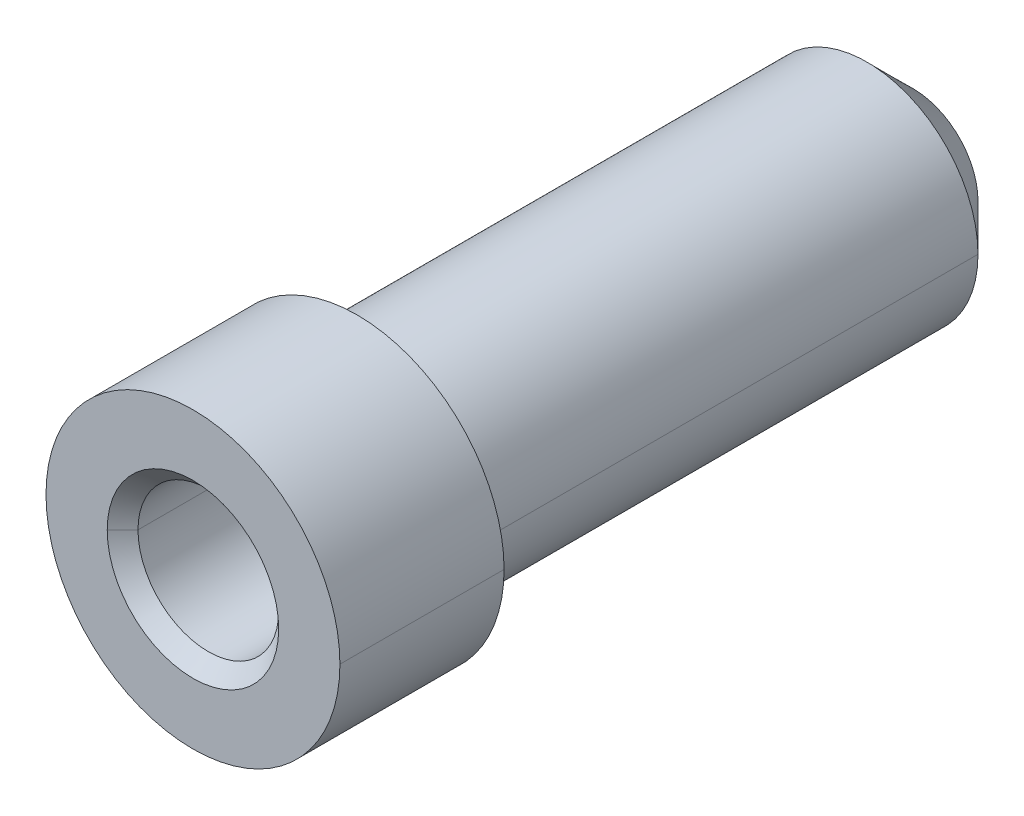
ISO-10303-21;
HEADER;
FILE_DESCRIPTION(('STEP AP214'),'2;1');
FILE_NAME('part.step','',(''),(''),'','','');
FILE_SCHEMA(('AUTOMOTIVE_DESIGN { 1 0 10303 214 1 1 1 1 }'));
ENDSEC;
DATA;
#1=APPLICATION_CONTEXT('core data for automotive mechanical design processes');
#2=APPLICATION_PROTOCOL_DEFINITION('international standard','automotive_design',2000,#1);
#3=PRODUCT_CONTEXT('',#1,'mechanical');
#4=PRODUCT('Part','Part','',(#3));
#5=PRODUCT_RELATED_PRODUCT_CATEGORY('part','',(#4));
#6=PRODUCT_DEFINITION_FORMATION('','',#4);
#7=PRODUCT_DEFINITION_CONTEXT('part definition',#1,'design');
#8=PRODUCT_DEFINITION('design','',#6,#7);
#9=PRODUCT_DEFINITION_SHAPE('','',#8);
#10=(LENGTH_UNIT() NAMED_UNIT(*) SI_UNIT(.MILLI.,.METRE.));
#11=(NAMED_UNIT(*) PLANE_ANGLE_UNIT() SI_UNIT($,.RADIAN.));
#12=(NAMED_UNIT(*) SI_UNIT($,.STERADIAN.) SOLID_ANGLE_UNIT());
#13=UNCERTAINTY_MEASURE_WITH_UNIT(LENGTH_MEASURE(1.E-05),#10,'distance_accuracy_value','');
#14=(GEOMETRIC_REPRESENTATION_CONTEXT(3) GLOBAL_UNCERTAINTY_ASSIGNED_CONTEXT((#13)) GLOBAL_UNIT_ASSIGNED_CONTEXT((#10,
#11,#12)) REPRESENTATION_CONTEXT('',''));
#15=CARTESIAN_POINT('',(0.,0.,0.));
#16=DIRECTION('',(0.,0.,1.));
#17=DIRECTION('',(1.,0.,0.));
#18=AXIS2_PLACEMENT_3D('',#15,#16,#17);
#19=CARTESIAN_POINT('',(4.21884749357559E-12,2.22044604925032E-12,-0.249999999991369));
#20=DIRECTION('',(0.,0.,1.));
#21=DIRECTION('',(1.,0.,0.));
#22=AXIS2_PLACEMENT_3D('',#19,#20,#21);
#23=CONICAL_SURFACE('',#22,1.14300000000017,0.78539816339745);
#24=CARTESIAN_POINT('',(4.21884749357559E-12,2.22044604925032E-12,-0.249999999991369));
#25=DIRECTION('',(0.,0.,1.));
#26=DIRECTION('',(-1.,0.,0.));
#27=AXIS2_PLACEMENT_3D('',#24,#25,#26);
#28=CIRCLE('',#27,1.14300000000017);
#29=CARTESIAN_POINT('',(-1.14299999999595,2.22201767524274E-12,-0.249999999991368));
#30=VERTEX_POINT('',#29);
#31=CARTESIAN_POINT('',(1.14300000000439,2.21911765591881E-12,-0.249999999991369));
#32=VERTEX_POINT('',#31);
#33=EDGE_CURVE('E41',#30,#32,#28,.T.);
#34=ORIENTED_EDGE('',*,*,#33,.F.);
#35=DIRECTION('',(-0.70710678118655,0.,0.707106781186545));
#36=VECTOR('',#35,1.);
#37=CARTESIAN_POINT('',(-1.14299999999595,2.22196604747685E-12,-0.249999999991369));
#38=LINE('',#37,#36);
#39=CARTESIAN_POINT('',(-1.39299999999615,2.22229677080818E-12,8.82654409631312E-12));
#40=VERTEX_POINT('',#39);
#41=EDGE_CURVE('E11',#30,#40,#38,.T.);
#42=ORIENTED_EDGE('',*,*,#41,.T.);
#43=CARTESIAN_POINT('',(4.44089209850063E-12,2.16493489801906E-12,8.82627304577E-12));
#44=DIRECTION('',(0.,0.,-1.));
#45=DIRECTION('',(-1.,0.,0.));
#46=AXIS2_PLACEMENT_3D('',#43,#44,#45);
#47=CIRCLE('',#46,1.39300000000021);
#48=CARTESIAN_POINT('',(1.39300000000458,2.21876245154462E-12,8.82600199522688E-12));
#49=VERTEX_POINT('',#48);
#50=EDGE_CURVE('E148',#49,#40,#47,.T.);
#51=ORIENTED_EDGE('',*,*,#50,.F.);
#52=DIRECTION('',(0.70710678118655,0.,0.707106781186545));
#53=VECTOR('',#52,1.);
#54=CARTESIAN_POINT('',(1.14300000000439,2.21906602815292E-12,-0.249999999991368));
#55=LINE('',#54,#53);
#56=EDGE_CURVE('E73',#32,#49,#55,.T.);
#57=ORIENTED_EDGE('',*,*,#56,.F.);
#58=EDGE_LOOP('',(#34,#42,#51,#57));
#59=FACE_BOUND('',#58,.T.);
#60=ADVANCED_FACE('F17',(#59),#23,.F.);
#61=CARTESIAN_POINT('',(4.99600361081321E-12,2.27595720048157E-12,-10.5409999999928));
#62=DIRECTION('',(0.,0.,1.));
#63=DIRECTION('',(1.,0.,0.));
#64=AXIS2_PLACEMENT_3D('',#61,#62,#63);
#65=CONICAL_SURFACE('',#64,1.14300000000017,1.0471975511966);
#66=DIRECTION('',(0.866025403784439,0.,0.5));
#67=VECTOR('',#66,1.);
#68=CARTESIAN_POINT('',(1.14300000000516,2.27457717938417E-12,-10.5409999999928));
#69=LINE('',#68,#67);
#70=CARTESIAN_POINT('',(3.99680288865057E-12,2.1094237467878E-12,-11.2009113576768));
#71=VERTEX_POINT('',#70);
#72=CARTESIAN_POINT('',(1.14300000000516,2.27457717938417E-12,-10.5409999999928));
#73=VERTEX_POINT('',#72);
#74=EDGE_CURVE('E127',#71,#73,#69,.T.);
#75=ORIENTED_EDGE('',*,*,#74,.F.);
#76=DIRECTION('',(-0.866025403784439,0.,0.5));
#77=VECTOR('',#76,1.);
#78=CARTESIAN_POINT('',(-1.14299999999517,2.27747719870811E-12,-10.5409999999928));
#79=LINE('',#78,#77);
#80=CARTESIAN_POINT('',(-1.14299999999517,2.22201767524276E-12,-10.5409999999928));
#81=VERTEX_POINT('',#80);
#82=EDGE_CURVE('E21',#71,#81,#79,.T.);
#83=ORIENTED_EDGE('',*,*,#82,.T.);
#84=CARTESIAN_POINT('',(4.99600361081321E-12,2.27595720048157E-12,-10.5409999999928));
#85=DIRECTION('',(0.,0.,1.));
#86=DIRECTION('',(1.,0.,0.));
#87=AXIS2_PLACEMENT_3D('',#84,#85,#86);
#88=CIRCLE('',#87,1.14300000000017);
#89=EDGE_CURVE('E117',#81,#73,#88,.T.);
#90=ORIENTED_EDGE('',*,*,#89,.T.);
#91=EDGE_LOOP('',(#75,#83,#90));
#92=FACE_BOUND('',#91,.T.);
#93=ADVANCED_FACE('F126',(#92),#65,.F.);
#94=CARTESIAN_POINT('',(4.99600361081321E-12,2.16493489801906E-12,-11.7009113576768));
#95=DIRECTION('',(0.,0.,1.));
#96=DIRECTION('',(1.,0.,0.));
#97=AXIS2_PLACEMENT_3D('',#94,#95,#96);
#98=CONICAL_SURFACE('',#97,1.05340000000016,0.78539816339745);
#99=CARTESIAN_POINT('',(4.99600361081321E-12,2.16493489801906E-12,-11.7009113576768));
#100=DIRECTION('',(0.,0.,1.));
#101=DIRECTION('',(1.,0.,0.));
#102=AXIS2_PLACEMENT_3D('',#99,#100,#101);
#103=CIRCLE('',#102,1.05340000000016);
#104=CARTESIAN_POINT('',(1.05340000000515,2.16366305705318E-12,-11.7009113576768));
#105=VERTEX_POINT('',#104);
#106=CARTESIAN_POINT('',(-1.05339999999516,2.16683182827574E-12,-11.7009113576768));
#107=VERTEX_POINT('',#106);
#108=EDGE_CURVE('E123',#105,#107,#103,.T.);
#109=ORIENTED_EDGE('',*,*,#108,.T.);
#110=DIRECTION('',(-0.70710678118655,0.,0.707106781186545));
#111=VECTOR('',#110,1.);
#112=CARTESIAN_POINT('',(-1.05339999999516,2.16633574327875E-12,-11.7009113576768));
#113=LINE('',#112,#111);
#114=CARTESIAN_POINT('',(-1.80339999999538,2.22290570425931E-12,-10.9509113576769));
#115=VERTEX_POINT('',#114);
#116=EDGE_CURVE('E146',#107,#115,#113,.T.);
#117=ORIENTED_EDGE('',*,*,#116,.T.);
#118=CARTESIAN_POINT('',(4.88498130835069E-12,2.33146835171283E-12,-10.9509113576769));
#119=DIRECTION('',(0.,0.,1.));
#120=DIRECTION('',(1.,0.,0.));
#121=AXIS2_PLACEMENT_3D('',#118,#119,#120);
#122=CIRCLE('',#121,1.80340000000027);
#123=CARTESIAN_POINT('',(1.80340000000515,2.32929098509249E-12,-10.9509113576769));
#124=VERTEX_POINT('',#123);
#125=EDGE_CURVE('E186',#124,#115,#122,.T.);
#126=ORIENTED_EDGE('',*,*,#125,.F.);
#127=DIRECTION('',(0.70710678118655,0.,0.707106781186545));
#128=VECTOR('',#127,1.);
#129=CARTESIAN_POINT('',(1.05340000000515,2.16366305705318E-12,-11.7009113576768));
#130=LINE('',#129,#128);
#131=EDGE_CURVE('E135',#105,#124,#130,.T.);
#132=ORIENTED_EDGE('',*,*,#131,.F.);
#133=EDGE_LOOP('',(#109,#117,#126,#132));
#134=FACE_BOUND('',#133,.T.);
#135=ADVANCED_FACE('F215',(#134),#98,.T.);
#136=CARTESIAN_POINT('',(4.21884749357559E-12,2.22044604925032E-12,2.0448451909536));
#137=DIRECTION('',(0.,0.,1.));
#138=DIRECTION('',(1.,0.,0.));
#139=AXIS2_PLACEMENT_3D('',#136,#137,#138);
#140=CYLINDRICAL_SURFACE('',#139,1.80340000000027);
#141=ORIENTED_EDGE('',*,*,#125,.T.);
#142=DIRECTION('',(0.,0.,1.));
#143=VECTOR('',#142,1.);
#144=CARTESIAN_POINT('',(-1.80339999999605,2.22284426867441E-12,2.0448451909536));
#145=LINE('',#144,#143);
#146=CARTESIAN_POINT('',(-1.80339999999527,2.2229057042593E-12,-2.66699999999182));
#147=VERTEX_POINT('',#146);
#148=EDGE_CURVE('E173',#115,#147,#145,.T.);
#149=ORIENTED_EDGE('',*,*,#148,.T.);
#150=CARTESIAN_POINT('',(4.99600361081321E-12,2.24820162486594E-12,-2.66699999999182));
#151=DIRECTION('',(0.,0.,1.));
#152=DIRECTION('',(1.,0.,0.));
#153=AXIS2_PLACEMENT_3D('',#150,#151,#152);
#154=CIRCLE('',#153,1.80340000000027);
#155=CARTESIAN_POINT('',(1.80340000000527,2.24602425824561E-12,-2.66699999999182));
#156=VERTEX_POINT('',#155);
#157=EDGE_CURVE('E161',#156,#147,#154,.T.);
#158=ORIENTED_EDGE('',*,*,#157,.F.);
#159=DIRECTION('',(0.,0.,1.));
#160=VECTOR('',#159,1.);
#161=CARTESIAN_POINT('',(1.80340000000448,2.21826868262998E-12,2.0448451909536));
#162=LINE('',#161,#160);
#163=EDGE_CURVE('E165',#124,#156,#162,.T.);
#164=ORIENTED_EDGE('',*,*,#163,.F.);
#165=EDGE_LOOP('',(#141,#149,#158,#164));
#166=FACE_BOUND('',#165,.T.);
#167=ADVANCED_FACE('F272',(#166),#140,.T.);
#168=CARTESIAN_POINT('',(4.21884749357559E-12,2.22044604925032E-12,2.0448451909536));
#169=DIRECTION('',(0.,0.,1.));
#170=DIRECTION('',(1.,0.,0.));
#171=AXIS2_PLACEMENT_3D('',#168,#169,#170);
#172=CYLINDRICAL_SURFACE('',#171,2.38760000000036);
#173=CARTESIAN_POINT('',(4.99600361081321E-12,2.24820162486594E-12,-2.66699999999182));
#174=DIRECTION('',(0.,0.,1.));
#175=DIRECTION('',(1.,0.,0.));
#176=AXIS2_PLACEMENT_3D('',#173,#174,#175);
#177=CIRCLE('',#176,2.38760000000036);
#178=CARTESIAN_POINT('',(2.38760000000535,2.24531891412916E-12,-2.66699999999182));
#179=VERTEX_POINT('',#178);
#180=CARTESIAN_POINT('',(-2.38759999999535,2.22364459863572E-12,-2.66699999999182));
#181=VERTEX_POINT('',#180);
#182=EDGE_CURVE('E160',#179,#181,#177,.T.);
#183=ORIENTED_EDGE('',*,*,#182,.T.);
#184=DIRECTION('',(0.,0.,1.));
#185=VECTOR('',#184,1.);
#186=CARTESIAN_POINT('',(-2.38759999999614,2.22362115665687E-12,2.0448451909536));
#187=LINE('',#186,#185);
#188=CARTESIAN_POINT('',(-2.38759999999591,2.22364459863571E-12,8.82667066104403E-12));
#189=VERTEX_POINT('',#188);
#190=EDGE_CURVE('E113',#181,#189,#187,.T.);
#191=ORIENTED_EDGE('',*,*,#190,.T.);
#192=CARTESIAN_POINT('',(4.44089209850063E-12,2.16493489801906E-12,8.82627304577E-12));
#193=DIRECTION('',(0.,0.,1.));
#194=DIRECTION('',(1.,0.,0.));
#195=AXIS2_PLACEMENT_3D('',#192,#193,#194);
#196=CIRCLE('',#195,2.38760000000036);
#197=CARTESIAN_POINT('',(2.3876000000048,2.16205218728227E-12,8.82693573789339E-12));
#198=VERTEX_POINT('',#197);
#199=EDGE_CURVE('E140',#198,#189,#196,.T.);
#200=ORIENTED_EDGE('',*,*,#199,.F.);
#201=DIRECTION('',(0.,0.,1.));
#202=VECTOR('',#201,1.);
#203=CARTESIAN_POINT('',(2.38760000000457,2.21756333851353E-12,2.0448451909536));
#204=LINE('',#203,#202);
#205=EDGE_CURVE('E156',#179,#198,#204,.T.);
#206=ORIENTED_EDGE('',*,*,#205,.F.);
#207=EDGE_LOOP('',(#183,#191,#200,#206));
#208=FACE_BOUND('',#207,.T.);
#209=ADVANCED_FACE('F247',(#208),#172,.T.);
#210=CARTESIAN_POINT('',(4.21884749357559E-12,2.22044604925032E-12,2.0448451909536));
#211=DIRECTION('',(0.,0.,1.));
#212=DIRECTION('',(1.,0.,0.));
#213=AXIS2_PLACEMENT_3D('',#210,#211,#212);
#214=CYLINDRICAL_SURFACE('',#213,1.14300000000017);
#215=ORIENTED_EDGE('',*,*,#89,.F.);
#216=DIRECTION('',(0.,0.,1.));
#217=VECTOR('',#216,1.);
#218=CARTESIAN_POINT('',(-1.14299999999595,2.22196604747685E-12,2.0448451909536));
#219=LINE('',#218,#217);
#220=EDGE_CURVE('E104',#81,#30,#219,.T.);
#221=ORIENTED_EDGE('',*,*,#220,.T.);
#222=ORIENTED_EDGE('',*,*,#33,.T.);
#223=DIRECTION('',(0.,0.,1.));
#224=VECTOR('',#223,1.);
#225=CARTESIAN_POINT('',(1.14300000000439,2.21906602815292E-12,2.0448451909536));
#226=LINE('',#225,#224);
#227=EDGE_CURVE('E120',#73,#32,#226,.T.);
#228=ORIENTED_EDGE('',*,*,#227,.F.);
#229=EDGE_LOOP('',(#215,#221,#222,#228));
#230=FACE_BOUND('',#229,.T.);
#231=ADVANCED_FACE('F119',(#230),#214,.F.);
#232=CARTESIAN_POINT('',(4.21884749357559E-12,2.22044604925032E-12,2.0448451909536));
#233=DIRECTION('',(0.,0.,1.));
#234=DIRECTION('',(1.,0.,0.));
#235=AXIS2_PLACEMENT_3D('',#232,#233,#234);
#236=CYLINDRICAL_SURFACE('',#235,1.14300000000017);
#237=ORIENTED_EDGE('',*,*,#220,.F.);
#238=CARTESIAN_POINT('',(4.99600361081321E-12,2.27595720048157E-12,-10.5409999999928));
#239=DIRECTION('',(0.,0.,1.));
#240=DIRECTION('',(1.,0.,0.));
#241=AXIS2_PLACEMENT_3D('',#238,#239,#240);
#242=CIRCLE('',#241,1.14300000000017);
#243=EDGE_CURVE('E108',#73,#81,#242,.T.);
#244=ORIENTED_EDGE('',*,*,#243,.F.);
#245=ORIENTED_EDGE('',*,*,#227,.T.);
#246=CARTESIAN_POINT('',(4.21884749357559E-12,2.22044604925032E-12,-0.249999999991369));
#247=DIRECTION('',(0.,0.,1.));
#248=DIRECTION('',(-1.,0.,0.));
#249=AXIS2_PLACEMENT_3D('',#246,#247,#248);
#250=CIRCLE('',#249,1.14300000000017);
#251=EDGE_CURVE('E109',#32,#30,#250,.T.);
#252=ORIENTED_EDGE('',*,*,#251,.T.);
#253=EDGE_LOOP('',(#237,#244,#245,#252));
#254=FACE_BOUND('',#253,.T.);
#255=ADVANCED_FACE('F106',(#254),#236,.F.);
#256=CARTESIAN_POINT('',(2.55351295663786E-12,1.14300000000223,8.49439876077218E-12));
#257=DIRECTION('',(0.,0.,-1.));
#258=DIRECTION('',(0.,-1.,0.));
#259=AXIS2_PLACEMENT_3D('',#256,#257,#258);
#260=PLANE('',#259);
#261=ORIENTED_EDGE('',*,*,#199,.T.);
#262=CARTESIAN_POINT('',(4.44089209850063E-12,2.16493489801906E-12,8.82627304577E-12));
#263=DIRECTION('',(0.,0.,1.));
#264=DIRECTION('',(1.,0.,0.));
#265=AXIS2_PLACEMENT_3D('',#262,#263,#264);
#266=CIRCLE('',#265,2.38760000000036);
#267=EDGE_CURVE('E143',#189,#198,#266,.T.);
#268=ORIENTED_EDGE('',*,*,#267,.T.);
#269=EDGE_LOOP('',(#261,#268));
#270=FACE_BOUND('',#269,.T.);
#271=ORIENTED_EDGE('',*,*,#50,.T.);
#272=CARTESIAN_POINT('',(4.44089209850063E-12,2.16493489801906E-12,8.82627304577E-12));
#273=DIRECTION('',(0.,0.,-1.));
#274=DIRECTION('',(-1.,0.,0.));
#275=AXIS2_PLACEMENT_3D('',#272,#273,#274);
#276=CIRCLE('',#275,1.39300000000021);
#277=EDGE_CURVE('E151',#40,#49,#276,.T.);
#278=ORIENTED_EDGE('',*,*,#277,.T.);
#279=EDGE_LOOP('',(#271,#278));
#280=FACE_BOUND('',#279,.T.);
#281=ADVANCED_FACE('F249',(#270,#280),#260,.F.);
#282=CARTESIAN_POINT('',(4.21884749357559E-12,2.22044604925032E-12,2.0448451909536));
#283=DIRECTION('',(0.,0.,1.));
#284=DIRECTION('',(1.,0.,0.));
#285=AXIS2_PLACEMENT_3D('',#282,#283,#284);
#286=CYLINDRICAL_SURFACE('',#285,2.38760000000036);
#287=ORIENTED_EDGE('',*,*,#190,.F.);
#288=CARTESIAN_POINT('',(4.99600361081321E-12,2.24820162486594E-12,-2.66699999999182));
#289=DIRECTION('',(0.,0.,1.));
#290=DIRECTION('',(1.,0.,0.));
#291=AXIS2_PLACEMENT_3D('',#288,#289,#290);
#292=CIRCLE('',#291,2.38760000000036);
#293=EDGE_CURVE('E152',#181,#179,#292,.T.);
#294=ORIENTED_EDGE('',*,*,#293,.T.);
#295=ORIENTED_EDGE('',*,*,#205,.T.);
#296=ORIENTED_EDGE('',*,*,#267,.F.);
#297=EDGE_LOOP('',(#287,#294,#295,#296));
#298=FACE_BOUND('',#297,.T.);
#299=ADVANCED_FACE('F245',(#298),#286,.T.);
#300=CARTESIAN_POINT('',(4.32986979603811E-12,2.38760000000235,-2.66699999999186));
#301=DIRECTION('',(0.,0.,1.));
#302=DIRECTION('',(0.,-1.,0.));
#303=AXIS2_PLACEMENT_3D('',#300,#301,#302);
#304=PLANE('',#303);
#305=ORIENTED_EDGE('',*,*,#182,.F.);
#306=ORIENTED_EDGE('',*,*,#293,.F.);
#307=EDGE_LOOP('',(#305,#306));
#308=FACE_BOUND('',#307,.T.);
#309=ORIENTED_EDGE('',*,*,#157,.T.);
#310=CARTESIAN_POINT('',(4.99600361081321E-12,2.24820162486594E-12,-2.66699999999182));
#311=DIRECTION('',(0.,0.,1.));
#312=DIRECTION('',(1.,0.,0.));
#313=AXIS2_PLACEMENT_3D('',#310,#311,#312);
#314=CIRCLE('',#313,1.80340000000027);
#315=EDGE_CURVE('E164',#147,#156,#314,.T.);
#316=ORIENTED_EDGE('',*,*,#315,.T.);
#317=EDGE_LOOP('',(#309,#316));
#318=FACE_BOUND('',#317,.T.);
#319=ADVANCED_FACE('F285',(#308,#318),#304,.F.);
#320=CARTESIAN_POINT('',(4.21884749357559E-12,2.22044604925032E-12,2.0448451909536));
#321=DIRECTION('',(0.,0.,1.));
#322=DIRECTION('',(1.,0.,0.));
#323=AXIS2_PLACEMENT_3D('',#320,#321,#322);
#324=CYLINDRICAL_SURFACE('',#323,1.80340000000027);
#325=ORIENTED_EDGE('',*,*,#148,.F.);
#326=CARTESIAN_POINT('',(4.88498130835069E-12,2.33146835171283E-12,-10.9509113576769));
#327=DIRECTION('',(0.,0.,1.));
#328=DIRECTION('',(1.,0.,0.));
#329=AXIS2_PLACEMENT_3D('',#326,#327,#328);
#330=CIRCLE('',#329,1.80340000000027);
#331=EDGE_CURVE('E168',#115,#124,#330,.T.);
#332=ORIENTED_EDGE('',*,*,#331,.T.);
#333=ORIENTED_EDGE('',*,*,#163,.T.);
#334=ORIENTED_EDGE('',*,*,#315,.F.);
#335=EDGE_LOOP('',(#325,#332,#333,#334));
#336=FACE_BOUND('',#335,.T.);
#337=ADVANCED_FACE('F223',(#336),#324,.T.);
#338=CARTESIAN_POINT('',(4.99600361081321E-12,2.16493489801906E-12,-11.7009113576768));
#339=DIRECTION('',(0.,0.,1.));
#340=DIRECTION('',(1.,0.,0.));
#341=AXIS2_PLACEMENT_3D('',#338,#339,#340);
#342=CONICAL_SURFACE('',#341,1.05340000000016,0.78539816339745);
#343=ORIENTED_EDGE('',*,*,#116,.F.);
#344=CARTESIAN_POINT('',(4.99600361081321E-12,2.16493489801906E-12,-11.7009113576768));
#345=DIRECTION('',(0.,0.,1.));
#346=DIRECTION('',(1.,0.,0.));
#347=AXIS2_PLACEMENT_3D('',#344,#345,#346);
#348=CIRCLE('',#347,1.05340000000016);
#349=EDGE_CURVE('E169',#107,#105,#348,.T.);
#350=ORIENTED_EDGE('',*,*,#349,.T.);
#351=ORIENTED_EDGE('',*,*,#131,.T.);
#352=ORIENTED_EDGE('',*,*,#331,.F.);
#353=EDGE_LOOP('',(#343,#350,#351,#352));
#354=FACE_BOUND('',#353,.T.);
#355=ADVANCED_FACE('F220',(#354),#342,.T.);
#356=CARTESIAN_POINT('',(2.88657986402541E-12,1.05340000000242,-11.7009113576768));
#357=DIRECTION('',(0.,0.,1.));
#358=DIRECTION('',(0.,-1.,0.));
#359=AXIS2_PLACEMENT_3D('',#356,#357,#358);
#360=PLANE('',#359);
#361=ORIENTED_EDGE('',*,*,#108,.F.);
#362=ORIENTED_EDGE('',*,*,#349,.F.);
#363=EDGE_LOOP('',(#361,#362));
#364=FACE_BOUND('',#363,.T.);
#365=ADVANCED_FACE('F260',(#364),#360,.F.);
#366=CARTESIAN_POINT('',(4.99600361081321E-12,2.27595720048157E-12,-10.5409999999928));
#367=DIRECTION('',(0.,0.,1.));
#368=DIRECTION('',(1.,0.,0.));
#369=AXIS2_PLACEMENT_3D('',#366,#367,#368);
#370=CONICAL_SURFACE('',#369,1.14300000000017,1.0471975511966);
#371=ORIENTED_EDGE('',*,*,#82,.F.);
#372=ORIENTED_EDGE('',*,*,#74,.T.);
#373=ORIENTED_EDGE('',*,*,#243,.T.);
#374=EDGE_LOOP('',(#371,#372,#373));
#375=FACE_BOUND('',#374,.T.);
#376=ADVANCED_FACE('F19',(#375),#370,.F.);
#377=CARTESIAN_POINT('',(4.21884749357559E-12,2.22044604925032E-12,-0.249999999991369));
#378=DIRECTION('',(0.,0.,1.));
#379=DIRECTION('',(1.,0.,0.));
#380=AXIS2_PLACEMENT_3D('',#377,#378,#379);
#381=CONICAL_SURFACE('',#380,1.14300000000017,0.78539816339745);
#382=ORIENTED_EDGE('',*,*,#41,.F.);
#383=ORIENTED_EDGE('',*,*,#251,.F.);
#384=ORIENTED_EDGE('',*,*,#56,.T.);
#385=ORIENTED_EDGE('',*,*,#277,.F.);
#386=EDGE_LOOP('',(#382,#383,#384,#385));
#387=FACE_BOUND('',#386,.T.);
#388=ADVANCED_FACE('F252',(#387),#381,.F.);
#389=CLOSED_SHELL('',(#60,#93,#135,#167,#209,#231,#255,#281,#299,#319,#337,#355,#365,#376,#388));
#390=MANIFOLD_SOLID_BREP('B1',#389);
#391=ADVANCED_BREP_SHAPE_REPRESENTATION('',(#18,#390),#14);
#392=SHAPE_DEFINITION_REPRESENTATION(#9,#391);
ENDSEC;
END-ISO-10303-21;
